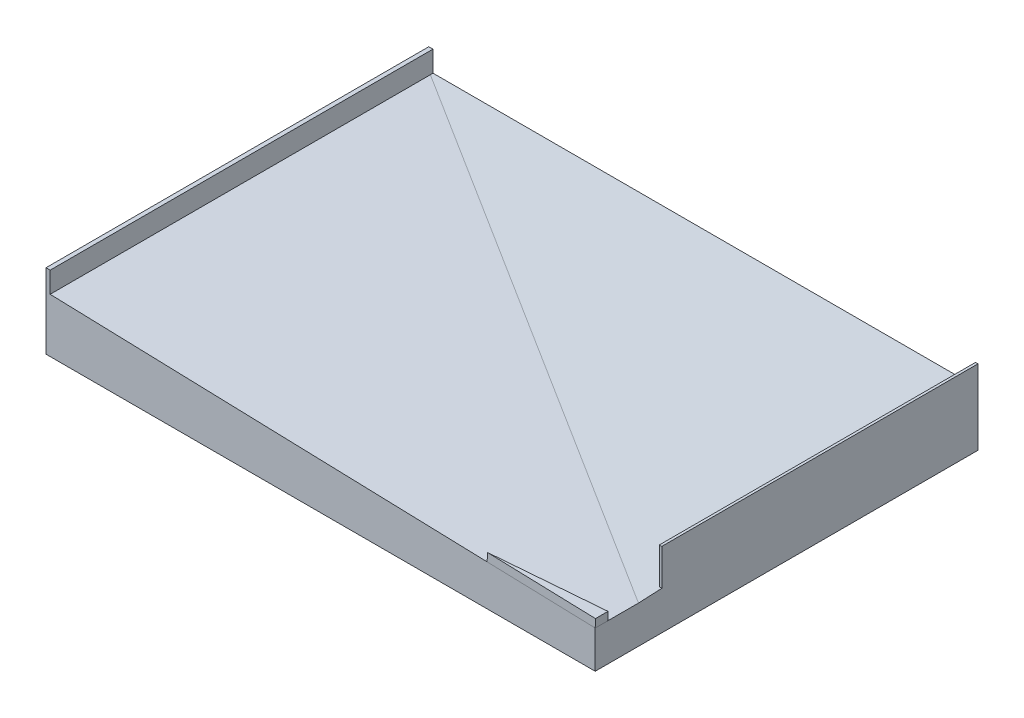
ISO-10303-21;
HEADER;
FILE_DESCRIPTION(('STEP AP214'),'2;1');
FILE_NAME('part.step','',(''),(''),'','','');
FILE_SCHEMA(('AUTOMOTIVE_DESIGN { 1 0 10303 214 1 1 1 1 }'));
ENDSEC;
DATA;
#1=APPLICATION_CONTEXT('core data for automotive mechanical design processes');
#2=APPLICATION_PROTOCOL_DEFINITION('international standard','automotive_design',2000,#1);
#3=PRODUCT_CONTEXT('',#1,'mechanical');
#4=PRODUCT('Part','Part','',(#3));
#5=PRODUCT_RELATED_PRODUCT_CATEGORY('part','',(#4));
#6=PRODUCT_DEFINITION_FORMATION('','',#4);
#7=PRODUCT_DEFINITION_CONTEXT('part definition',#1,'design');
#8=PRODUCT_DEFINITION('design','',#6,#7);
#9=PRODUCT_DEFINITION_SHAPE('','',#8);
#10=(LENGTH_UNIT() NAMED_UNIT(*) SI_UNIT(.MILLI.,.METRE.));
#11=(NAMED_UNIT(*) PLANE_ANGLE_UNIT() SI_UNIT($,.RADIAN.));
#12=(NAMED_UNIT(*) SI_UNIT($,.STERADIAN.) SOLID_ANGLE_UNIT());
#13=UNCERTAINTY_MEASURE_WITH_UNIT(LENGTH_MEASURE(1.E-05),#10,'distance_accuracy_value','');
#14=(GEOMETRIC_REPRESENTATION_CONTEXT(3) GLOBAL_UNCERTAINTY_ASSIGNED_CONTEXT((#13)) GLOBAL_UNIT_ASSIGNED_CONTEXT((#10,
#11,#12)) REPRESENTATION_CONTEXT('',''));
#15=CARTESIAN_POINT('',(0.,0.,0.));
#16=DIRECTION('',(0.,0.,1.));
#17=DIRECTION('',(1.,0.,0.));
#18=AXIS2_PLACEMENT_3D('',#15,#16,#17);
#19=CARTESIAN_POINT('',(419.484671908338,69.8441729751466,0.));
#20=DIRECTION('',(-0.999541179145381,0.030289126640769,0.));
#21=DIRECTION('',(-0.030289126640769,-0.999541179145381,0.));
#22=AXIS2_PLACEMENT_3D('',#19,#20,#21);
#23=PLANE('',#22);
#24=DIRECTION('',(0.,0.,-1.));
#25=VECTOR('',#24,1.);
#26=CARTESIAN_POINT('',(419.1,57.1500000000002,0.));
#27=LINE('',#26,#25);
#28=CARTESIAN_POINT('',(419.1,57.1500000000002,0.));
#29=VERTEX_POINT('',#28);
#30=CARTESIAN_POINT('',(419.1,57.1500000000002,-19.1292765332465));
#31=VERTEX_POINT('',#30);
#32=EDGE_CURVE('E102',#29,#31,#27,.T.);
#33=ORIENTED_EDGE('',*,*,#32,.T.);
#34=DIRECTION('',(-0.030289126640769,-0.999541179145381,0.));
#35=VECTOR('',#34,1.);
#36=CARTESIAN_POINT('',(419.484671908338,69.8441729751466,-19.1292765332465));
#37=LINE('',#36,#35);
#38=CARTESIAN_POINT('',(419.484671908338,69.8441729751466,-19.1292765332465));
#39=VERTEX_POINT('',#38);
#40=EDGE_CURVE('E12',#39,#31,#37,.T.);
#41=ORIENTED_EDGE('',*,*,#40,.F.);
#42=DIRECTION('',(0.,0.,-1.));
#43=VECTOR('',#42,1.);
#44=CARTESIAN_POINT('',(419.484671908338,69.8441729751466,0.));
#45=LINE('',#44,#43);
#46=CARTESIAN_POINT('',(419.484671908338,69.8441729751466,0.));
#47=VERTEX_POINT('',#46);
#48=EDGE_CURVE('E95',#47,#39,#45,.T.);
#49=ORIENTED_EDGE('',*,*,#48,.F.);
#50=DIRECTION('',(-0.030289126640769,-0.999541179145381,0.));
#51=VECTOR('',#50,1.);
#52=CARTESIAN_POINT('',(419.484671908338,69.8441729751466,0.));
#53=LINE('',#52,#51);
#54=EDGE_CURVE('E103',#47,#29,#53,.T.);
#55=ORIENTED_EDGE('',*,*,#54,.T.);
#56=EDGE_LOOP('',(#33,#41,#49,#55));
#57=FACE_BOUND('',#56,.T.);
#58=ADVANCED_FACE('F55',(#57),#23,.F.);
#59=CARTESIAN_POINT('',(5.8444542061717,82.3787250267273,28.8593542194809));
#60=DIRECTION('',(0.115137398895565,-0.00348901208774436,0.993343448244471));
#61=DIRECTION('',(0.99334949438656,0.,-0.115138099697563));
#62=AXIS2_PLACEMENT_3D('',#59,#60,#61);
#63=PLANE('',#62);
#64=DIRECTION('',(-0.992887681554617,0.0300875055016549,0.115190250584782));
#65=VECTOR('',#64,1.);
#66=CARTESIAN_POINT('',(5.45978229783393,69.6845520515809,28.8593542194809));
#67=LINE('',#66,#65);
#68=CARTESIAN_POINT('',(254.21431800443,62.1465358180477,0.));
#69=VERTEX_POINT('',#68);
#70=EDGE_CURVE('E83',#31,#69,#67,.T.);
#71=ORIENTED_EDGE('',*,*,#70,.T.);
#72=DIRECTION('',(-0.030289126640769,-0.999541179145381,0.));
#73=VECTOR('',#72,1.);
#74=CARTESIAN_POINT('',(254.598989912768,74.8407087931941,0.));
#75=LINE('',#74,#73);
#76=CARTESIAN_POINT('',(254.598989912768,74.8407087931941,0.));
#77=VERTEX_POINT('',#76);
#78=EDGE_CURVE('E63',#77,#69,#75,.T.);
#79=ORIENTED_EDGE('',*,*,#78,.F.);
#80=DIRECTION('',(-0.992887681554617,0.0300875055016549,0.115190250584782));
#81=VECTOR('',#80,1.);
#82=CARTESIAN_POINT('',(5.8444542061717,82.3787250267273,28.8593542194809));
#83=LINE('',#82,#81);
#84=EDGE_CURVE('E91',#39,#77,#83,.T.);
#85=ORIENTED_EDGE('',*,*,#84,.F.);
#86=ORIENTED_EDGE('',*,*,#40,.T.);
#87=EDGE_LOOP('',(#71,#79,#85,#86));
#88=FACE_BOUND('',#87,.T.);
#89=ADVANCED_FACE('F92',(#88),#63,.F.);
#90=CARTESIAN_POINT('',(2.49939667897996,82.4800904063391,0.));
#91=DIRECTION('',(0.,0.,-1.));
#92=DIRECTION('',(-1.,0.,0.));
#93=AXIS2_PLACEMENT_3D('',#90,#91,#92);
#94=PLANE('',#93);
#95=DIRECTION('',(0.999541179145382,-0.030289126640769,0.));
#96=VECTOR('',#95,1.);
#97=CARTESIAN_POINT('',(2.11472477064219,69.7859174311928,0.));
#98=LINE('',#97,#96);
#99=EDGE_CURVE('E88',#69,#29,#98,.T.);
#100=ORIENTED_EDGE('',*,*,#99,.T.);
#101=ORIENTED_EDGE('',*,*,#54,.F.);
#102=DIRECTION('',(0.999541179145382,-0.030289126640769,0.));
#103=VECTOR('',#102,1.);
#104=CARTESIAN_POINT('',(2.49939667897996,82.4800904063391,0.));
#105=LINE('',#104,#103);
#106=EDGE_CURVE('E71',#77,#47,#105,.T.);
#107=ORIENTED_EDGE('',*,*,#106,.F.);
#108=ORIENTED_EDGE('',*,*,#78,.T.);
#109=EDGE_LOOP('',(#100,#101,#107,#108));
#110=FACE_BOUND('',#109,.T.);
#111=ADVANCED_FACE('F110',(#110),#94,.F.);
#112=CARTESIAN_POINT('',(2.49939667897996,82.4800904063391,0.));
#113=DIRECTION('',(0.030289126640769,0.999541179145382,0.));
#114=DIRECTION('',(-0.999541179145382,0.030289126640769,0.));
#115=AXIS2_PLACEMENT_3D('',#112,#113,#114);
#116=PLANE('',#115);
#117=ORIENTED_EDGE('',*,*,#48,.T.);
#118=ORIENTED_EDGE('',*,*,#84,.T.);
#119=ORIENTED_EDGE('',*,*,#106,.T.);
#120=EDGE_LOOP('',(#117,#118,#119));
#121=FACE_BOUND('',#120,.T.);
#122=ADVANCED_FACE('F98',(#121),#116,.T.);
#123=CARTESIAN_POINT('',(2.11472477064219,69.7859174311928,0.));
#124=DIRECTION('',(0.030289126640769,0.999541179145382,0.));
#125=DIRECTION('',(-0.999541179145382,0.030289126640769,0.));
#126=AXIS2_PLACEMENT_3D('',#123,#124,#125);
#127=PLANE('',#126);
#128=ORIENTED_EDGE('',*,*,#32,.F.);
#129=ORIENTED_EDGE('',*,*,#99,.F.);
#130=ORIENTED_EDGE('',*,*,#70,.F.);
#131=EDGE_LOOP('',(#128,#129,#130));
#132=FACE_BOUND('',#131,.T.);
#133=ADVANCED_FACE('F111',(#132),#127,.F.);
#134=CLOSED_SHELL('',(#58,#89,#111,#122,#133));
#135=MANIFOLD_SOLID_BREP('B2',#134);
#136=CARTESIAN_POINT('',(-943.794471192522,82.55,-584.2));
#137=DIRECTION('',(0.,0.998800699959469,0.0489608186254638));
#138=DIRECTION('',(0.,-0.0489608186254638,0.998800699959469));
#139=AXIS2_PLACEMENT_3D('',#136,#137,#138);
#140=PLANE('',#139);
#141=DIRECTION('',(-1.,0.,0.));
#142=VECTOR('',#141,1.);
#143=CARTESIAN_POINT('',(-943.794471192522,58.8931372549021,-101.6));
#144=LINE('',#143,#142);
#145=CARTESIAN_POINT('',(419.1,58.8931372549021,-101.6));
#146=VERTEX_POINT('',#145);
#147=CARTESIAN_POINT('',(415.33308629776,58.8931372549021,-101.6));
#148=VERTEX_POINT('',#147);
#149=EDGE_CURVE('E279',#146,#148,#144,.T.);
#150=ORIENTED_EDGE('',*,*,#149,.T.);
#151=DIRECTION('',(0.,0.0489608186254638,-0.998800699959469));
#152=VECTOR('',#151,1.);
#153=CARTESIAN_POINT('',(415.33308629776,82.55,-584.2));
#154=LINE('',#153,#152);
#155=CARTESIAN_POINT('',(415.33308629776,82.55,-584.2));
#156=VERTEX_POINT('',#155);
#157=EDGE_CURVE('E273',#148,#156,#154,.T.);
#158=ORIENTED_EDGE('',*,*,#157,.T.);
#159=DIRECTION('',(1.,0.,0.));
#160=VECTOR('',#159,1.);
#161=CARTESIAN_POINT('',(-943.794471192522,82.55,-584.2));
#162=LINE('',#161,#160);
#163=CARTESIAN_POINT('',(-412.75,82.55,-584.2));
#164=VERTEX_POINT('',#163);
#165=EDGE_CURVE('E314',#164,#156,#162,.T.);
#166=ORIENTED_EDGE('',*,*,#165,.F.);
#167=DIRECTION('',(0.,-0.0489608186254638,0.998800699959469));
#168=VECTOR('',#167,1.);
#169=CARTESIAN_POINT('',(-412.75,82.55,-584.2));
#170=LINE('',#169,#168);
#171=CARTESIAN_POINT('',(-412.75,82.3575757575758,-580.274545454545));
#172=VERTEX_POINT('',#171);
#173=EDGE_CURVE('E53',#164,#172,#170,.T.);
#174=ORIENTED_EDGE('',*,*,#173,.T.);
#175=DIRECTION('',(0.850312150745116,-0.025767034871064,0.525647511369709));
#176=VECTOR('',#175,1.);
#177=CARTESIAN_POINT('',(-419.1,82.55,-584.2));
#178=LINE('',#177,#176);
#179=CARTESIAN_POINT('',(419.1,57.1500000000002,-66.04));
#180=VERTEX_POINT('',#179);
#181=EDGE_CURVE('E317',#172,#180,#178,.T.);
#182=ORIENTED_EDGE('',*,*,#181,.T.);
#183=DIRECTION('',(0.,-0.0489608186254638,0.998800699959469));
#184=VECTOR('',#183,1.);
#185=CARTESIAN_POINT('',(419.1,82.55,-584.2));
#186=LINE('',#185,#184);
#187=EDGE_CURVE('E311',#146,#180,#186,.T.);
#188=ORIENTED_EDGE('',*,*,#187,.F.);
#189=EDGE_LOOP('',(#150,#158,#166,#174,#182,#188));
#190=FACE_BOUND('',#189,.T.);
#191=ADVANCED_FACE('F169',(#190),#140,.T.);
#192=CARTESIAN_POINT('',(-419.1,82.55,-584.2));
#193=DIRECTION('',(0.0302891266407689,0.999541179145381,0.));
#194=DIRECTION('',(-0.999541179145382,0.030289126640769,0.));
#195=AXIS2_PLACEMENT_3D('',#192,#193,#194);
#196=PLANE('',#195);
#197=ORIENTED_EDGE('',*,*,#181,.F.);
#198=DIRECTION('',(0.,0.,1.));
#199=VECTOR('',#198,1.);
#200=CARTESIAN_POINT('',(-412.75,82.3575757575758,-584.2));
#201=LINE('',#200,#199);
#202=CARTESIAN_POINT('',(-412.75,82.3575757575758,0.));
#203=VERTEX_POINT('',#202);
#204=EDGE_CURVE('E307',#172,#203,#201,.T.);
#205=ORIENTED_EDGE('',*,*,#204,.T.);
#206=DIRECTION('',(-0.999541179145381,0.030289126640769,0.));
#207=VECTOR('',#206,1.);
#208=CARTESIAN_POINT('',(-419.1,82.55,0.));
#209=LINE('',#208,#207);
#210=CARTESIAN_POINT('',(419.1,57.1500000000002,0.));
#211=VERTEX_POINT('',#210);
#212=EDGE_CURVE('E321',#211,#203,#209,.T.);
#213=ORIENTED_EDGE('',*,*,#212,.F.);
#214=DIRECTION('',(0.,0.,1.));
#215=VECTOR('',#214,1.);
#216=CARTESIAN_POINT('',(419.1,57.1500000000002,-584.2));
#217=LINE('',#216,#215);
#218=EDGE_CURVE('E178',#180,#211,#217,.T.);
#219=ORIENTED_EDGE('',*,*,#218,.F.);
#220=EDGE_LOOP('',(#197,#205,#213,#219));
#221=FACE_BOUND('',#220,.T.);
#222=ADVANCED_FACE('F171',(#221),#196,.T.);
#223=CARTESIAN_POINT('',(419.1,57.1500000000002,-584.2));
#224=DIRECTION('',(1.,0.,0.));
#225=DIRECTION('',(0.,0.,-1.));
#226=AXIS2_PLACEMENT_3D('',#223,#224,#225);
#227=PLANE('',#226);
#228=DIRECTION('',(0.,1.,0.));
#229=VECTOR('',#228,1.);
#230=CARTESIAN_POINT('',(419.1,57.1500000000002,-584.2));
#231=LINE('',#230,#229);
#232=CARTESIAN_POINT('',(419.1,0.,-584.2));
#233=VERTEX_POINT('',#232);
#234=CARTESIAN_POINT('',(419.1,114.3,-584.2));
#235=VERTEX_POINT('',#234);
#236=EDGE_CURVE('E249',#233,#235,#231,.T.);
#237=ORIENTED_EDGE('',*,*,#236,.T.);
#238=DIRECTION('',(0.,0.,-1.));
#239=VECTOR('',#238,1.);
#240=CARTESIAN_POINT('',(419.1,114.3,-584.2));
#241=LINE('',#240,#239);
#242=CARTESIAN_POINT('',(419.1,114.3,-101.6));
#243=VERTEX_POINT('',#242);
#244=EDGE_CURVE('E252',#243,#235,#241,.T.);
#245=ORIENTED_EDGE('',*,*,#244,.F.);
#246=DIRECTION('',(0.,-1.,0.));
#247=VECTOR('',#246,1.);
#248=CARTESIAN_POINT('',(419.1,114.3,-101.6));
#249=LINE('',#248,#247);
#250=EDGE_CURVE('E185',#243,#146,#249,.T.);
#251=ORIENTED_EDGE('',*,*,#250,.T.);
#252=ORIENTED_EDGE('',*,*,#187,.T.);
#253=ORIENTED_EDGE('',*,*,#218,.T.);
#254=DIRECTION('',(0.,1.,0.));
#255=VECTOR('',#254,1.);
#256=CARTESIAN_POINT('',(419.1,57.1500000000002,0.));
#257=LINE('',#256,#255);
#258=CARTESIAN_POINT('',(419.1,0.,0.));
#259=VERTEX_POINT('',#258);
#260=EDGE_CURVE('E326',#259,#211,#257,.T.);
#261=ORIENTED_EDGE('',*,*,#260,.F.);
#262=DIRECTION('',(0.,0.,1.));
#263=VECTOR('',#262,1.);
#264=CARTESIAN_POINT('',(419.1,0.,-584.2));
#265=LINE('',#264,#263);
#266=EDGE_CURVE('E254',#233,#259,#265,.T.);
#267=ORIENTED_EDGE('',*,*,#266,.F.);
#268=EDGE_LOOP('',(#237,#245,#251,#252,#253,#261,#267));
#269=FACE_BOUND('',#268,.T.);
#270=ADVANCED_FACE('F251',(#269),#227,.T.);
#271=CARTESIAN_POINT('',(-419.1,0.,-584.2));
#272=DIRECTION('',(0.,-1.,0.));
#273=DIRECTION('',(0.,0.,-1.));
#274=AXIS2_PLACEMENT_3D('',#271,#272,#273);
#275=PLANE('',#274);
#276=DIRECTION('',(1.,0.,0.));
#277=VECTOR('',#276,1.);
#278=CARTESIAN_POINT('',(-419.1,0.,-584.2));
#279=LINE('',#278,#277);
#280=CARTESIAN_POINT('',(-419.1,0.,-584.2));
#281=VERTEX_POINT('',#280);
#282=EDGE_CURVE('E259',#281,#233,#279,.T.);
#283=ORIENTED_EDGE('',*,*,#282,.T.);
#284=ORIENTED_EDGE('',*,*,#266,.T.);
#285=DIRECTION('',(1.,0.,0.));
#286=VECTOR('',#285,1.);
#287=CARTESIAN_POINT('',(-419.1,0.,0.));
#288=LINE('',#287,#286);
#289=CARTESIAN_POINT('',(-419.1,0.,0.));
#290=VERTEX_POINT('',#289);
#291=EDGE_CURVE('E336',#290,#259,#288,.T.);
#292=ORIENTED_EDGE('',*,*,#291,.F.);
#293=DIRECTION('',(0.,0.,1.));
#294=VECTOR('',#293,1.);
#295=CARTESIAN_POINT('',(-419.1,0.,-584.2));
#296=LINE('',#295,#294);
#297=EDGE_CURVE('E258',#281,#290,#296,.T.);
#298=ORIENTED_EDGE('',*,*,#297,.F.);
#299=EDGE_LOOP('',(#283,#284,#292,#298));
#300=FACE_BOUND('',#299,.T.);
#301=ADVANCED_FACE('F352',(#300),#275,.T.);
#302=CARTESIAN_POINT('',(-419.1,0.,-584.2));
#303=DIRECTION('',(-1.,0.,0.));
#304=DIRECTION('',(0.,0.,1.));
#305=AXIS2_PLACEMENT_3D('',#302,#303,#304);
#306=PLANE('',#305);
#307=ORIENTED_EDGE('',*,*,#297,.T.);
#308=DIRECTION('',(0.,-1.,0.));
#309=VECTOR('',#308,1.);
#310=CARTESIAN_POINT('',(-419.1,0.,0.));
#311=LINE('',#310,#309);
#312=CARTESIAN_POINT('',(-419.1,114.3,0.));
#313=VERTEX_POINT('',#312);
#314=EDGE_CURVE('E332',#313,#290,#311,.T.);
#315=ORIENTED_EDGE('',*,*,#314,.F.);
#316=DIRECTION('',(0.,0.,1.));
#317=VECTOR('',#316,1.);
#318=CARTESIAN_POINT('',(-419.1,114.3,-584.2));
#319=LINE('',#318,#317);
#320=CARTESIAN_POINT('',(-419.1,114.3,-584.2));
#321=VERTEX_POINT('',#320);
#322=EDGE_CURVE('E298',#321,#313,#319,.T.);
#323=ORIENTED_EDGE('',*,*,#322,.F.);
#324=DIRECTION('',(0.,-1.,0.));
#325=VECTOR('',#324,1.);
#326=CARTESIAN_POINT('',(-419.1,0.,-584.2));
#327=LINE('',#326,#325);
#328=EDGE_CURVE('E322',#321,#281,#327,.T.);
#329=ORIENTED_EDGE('',*,*,#328,.T.);
#330=EDGE_LOOP('',(#307,#315,#323,#329));
#331=FACE_BOUND('',#330,.T.);
#332=ADVANCED_FACE('F349',(#331),#306,.T.);
#333=CARTESIAN_POINT('',(0.,0.,-584.2));
#334=DIRECTION('',(0.,0.,-1.));
#335=DIRECTION('',(-1.,0.,0.));
#336=AXIS2_PLACEMENT_3D('',#333,#334,#335);
#337=PLANE('',#336);
#338=ORIENTED_EDGE('',*,*,#236,.F.);
#339=ORIENTED_EDGE('',*,*,#282,.F.);
#340=ORIENTED_EDGE('',*,*,#328,.F.);
#341=DIRECTION('',(-1.,0.,0.));
#342=VECTOR('',#341,1.);
#343=CARTESIAN_POINT('',(-419.1,114.3,-584.2));
#344=LINE('',#343,#342);
#345=CARTESIAN_POINT('',(-412.75,114.3,-584.2));
#346=VERTEX_POINT('',#345);
#347=EDGE_CURVE('E294',#346,#321,#344,.T.);
#348=ORIENTED_EDGE('',*,*,#347,.F.);
#349=DIRECTION('',(0.,-1.,0.));
#350=VECTOR('',#349,1.);
#351=CARTESIAN_POINT('',(-412.75,114.3,-584.2));
#352=LINE('',#351,#350);
#353=EDGE_CURVE('E193',#346,#164,#352,.T.);
#354=ORIENTED_EDGE('',*,*,#353,.T.);
#355=ORIENTED_EDGE('',*,*,#165,.T.);
#356=DIRECTION('',(0.,-1.,0.));
#357=VECTOR('',#356,1.);
#358=CARTESIAN_POINT('',(415.33308629776,114.3,-584.2));
#359=LINE('',#358,#357);
#360=CARTESIAN_POINT('',(415.33308629776,114.3,-584.2));
#361=VERTEX_POINT('',#360);
#362=EDGE_CURVE('E271',#361,#156,#359,.T.);
#363=ORIENTED_EDGE('',*,*,#362,.F.);
#364=DIRECTION('',(-1.,0.,0.));
#365=VECTOR('',#364,1.);
#366=CARTESIAN_POINT('',(415.33308629776,114.3,-584.2));
#367=LINE('',#366,#365);
#368=EDGE_CURVE('E264',#235,#361,#367,.T.);
#369=ORIENTED_EDGE('',*,*,#368,.F.);
#370=EDGE_LOOP('',(#338,#339,#340,#348,#354,#355,#363,#369));
#371=FACE_BOUND('',#370,.T.);
#372=ADVANCED_FACE('F270',(#371),#337,.T.);
#373=CARTESIAN_POINT('',(0.,0.,0.));
#374=DIRECTION('',(0.,0.,-1.));
#375=DIRECTION('',(-1.,0.,0.));
#376=AXIS2_PLACEMENT_3D('',#373,#374,#375);
#377=PLANE('',#376);
#378=ORIENTED_EDGE('',*,*,#291,.T.);
#379=ORIENTED_EDGE('',*,*,#260,.T.);
#380=ORIENTED_EDGE('',*,*,#212,.T.);
#381=DIRECTION('',(0.,-1.,0.));
#382=VECTOR('',#381,1.);
#383=CARTESIAN_POINT('',(-412.75,114.3,0.));
#384=LINE('',#383,#382);
#385=CARTESIAN_POINT('',(-412.75,114.3,0.));
#386=VERTEX_POINT('',#385);
#387=EDGE_CURVE('E304',#386,#203,#384,.T.);
#388=ORIENTED_EDGE('',*,*,#387,.F.);
#389=DIRECTION('',(1.,0.,0.));
#390=VECTOR('',#389,1.);
#391=CARTESIAN_POINT('',(-419.1,114.3,0.));
#392=LINE('',#391,#390);
#393=EDGE_CURVE('E287',#313,#386,#392,.T.);
#394=ORIENTED_EDGE('',*,*,#393,.F.);
#395=ORIENTED_EDGE('',*,*,#314,.T.);
#396=EDGE_LOOP('',(#378,#379,#380,#388,#394,#395));
#397=FACE_BOUND('',#396,.T.);
#398=ADVANCED_FACE('F355',(#397),#377,.F.);
#399=CARTESIAN_POINT('',(-412.75,114.3,-579.774242424242));
#400=DIRECTION('',(-1.,0.,0.));
#401=DIRECTION('',(0.,0.,1.));
#402=AXIS2_PLACEMENT_3D('',#399,#400,#401);
#403=PLANE('',#402);
#404=ORIENTED_EDGE('',*,*,#204,.F.);
#405=ORIENTED_EDGE('',*,*,#173,.F.);
#406=ORIENTED_EDGE('',*,*,#353,.F.);
#407=DIRECTION('',(0.,0.,-1.));
#408=VECTOR('',#407,1.);
#409=CARTESIAN_POINT('',(-412.75,114.3,-6.35));
#410=LINE('',#409,#408);
#411=EDGE_CURVE('E291',#386,#346,#410,.T.);
#412=ORIENTED_EDGE('',*,*,#411,.F.);
#413=ORIENTED_EDGE('',*,*,#387,.T.);
#414=EDGE_LOOP('',(#404,#405,#406,#412,#413));
#415=FACE_BOUND('',#414,.T.);
#416=ADVANCED_FACE('F360',(#415),#403,.F.);
#417=CARTESIAN_POINT('',(0.,114.3,0.));
#418=DIRECTION('',(0.,-1.,0.));
#419=DIRECTION('',(0.,0.,-1.));
#420=AXIS2_PLACEMENT_3D('',#417,#418,#419);
#421=PLANE('',#420);
#422=ORIENTED_EDGE('',*,*,#393,.T.);
#423=ORIENTED_EDGE('',*,*,#411,.T.);
#424=ORIENTED_EDGE('',*,*,#347,.T.);
#425=ORIENTED_EDGE('',*,*,#322,.T.);
#426=EDGE_LOOP('',(#422,#423,#424,#425));
#427=FACE_BOUND('',#426,.T.);
#428=ADVANCED_FACE('F358',(#427),#421,.F.);
#429=CARTESIAN_POINT('',(415.33308629776,114.3,-579.638290513834));
#430=DIRECTION('',(1.,0.,0.));
#431=DIRECTION('',(0.,0.,-1.));
#432=AXIS2_PLACEMENT_3D('',#429,#430,#431);
#433=PLANE('',#432);
#434=ORIENTED_EDGE('',*,*,#157,.F.);
#435=DIRECTION('',(0.,-1.,0.));
#436=VECTOR('',#435,1.);
#437=CARTESIAN_POINT('',(415.33308629776,114.3,-101.6));
#438=LINE('',#437,#436);
#439=CARTESIAN_POINT('',(415.33308629776,114.3,-101.6));
#440=VERTEX_POINT('',#439);
#441=EDGE_CURVE('E369',#440,#148,#438,.T.);
#442=ORIENTED_EDGE('',*,*,#441,.F.);
#443=DIRECTION('',(0.,0.,1.));
#444=VECTOR('',#443,1.);
#445=CARTESIAN_POINT('',(415.33308629776,114.3,-579.638290513834));
#446=LINE('',#445,#444);
#447=EDGE_CURVE('E274',#361,#440,#446,.T.);
#448=ORIENTED_EDGE('',*,*,#447,.F.);
#449=ORIENTED_EDGE('',*,*,#362,.T.);
#450=EDGE_LOOP('',(#434,#442,#448,#449));
#451=FACE_BOUND('',#450,.T.);
#452=ADVANCED_FACE('F368',(#451),#433,.F.);
#453=CARTESIAN_POINT('',(415.33308629776,114.3,-101.6));
#454=DIRECTION('',(0.,0.,-1.));
#455=DIRECTION('',(-1.,0.,0.));
#456=AXIS2_PLACEMENT_3D('',#453,#454,#455);
#457=PLANE('',#456);
#458=ORIENTED_EDGE('',*,*,#149,.F.);
#459=ORIENTED_EDGE('',*,*,#250,.F.);
#460=DIRECTION('',(1.,0.,0.));
#461=VECTOR('',#460,1.);
#462=CARTESIAN_POINT('',(415.33308629776,114.3,-101.6));
#463=LINE('',#462,#461);
#464=EDGE_CURVE('E267',#440,#243,#463,.T.);
#465=ORIENTED_EDGE('',*,*,#464,.F.);
#466=ORIENTED_EDGE('',*,*,#441,.T.);
#467=EDGE_LOOP('',(#458,#459,#465,#466));
#468=FACE_BOUND('',#467,.T.);
#469=ADVANCED_FACE('F371',(#468),#457,.F.);
#470=CARTESIAN_POINT('',(0.,114.3,0.));
#471=DIRECTION('',(0.,-1.,0.));
#472=DIRECTION('',(0.,0.,-1.));
#473=AXIS2_PLACEMENT_3D('',#470,#471,#472);
#474=PLANE('',#473);
#475=ORIENTED_EDGE('',*,*,#368,.T.);
#476=ORIENTED_EDGE('',*,*,#447,.T.);
#477=ORIENTED_EDGE('',*,*,#464,.T.);
#478=ORIENTED_EDGE('',*,*,#244,.T.);
#479=EDGE_LOOP('',(#475,#476,#477,#478));
#480=FACE_BOUND('',#479,.T.);
#481=ADVANCED_FACE('F263',(#480),#474,.F.);
#482=CLOSED_SHELL('',(#191,#222,#270,#301,#332,#372,#398,#416,#428,#452,#469,#481));
#483=MANIFOLD_SOLID_BREP('B6',#482);
#484=ADVANCED_BREP_SHAPE_REPRESENTATION('',(#18,#135,#483),#14);
#485=SHAPE_DEFINITION_REPRESENTATION(#9,#484);
ENDSEC;
END-ISO-10303-21;
